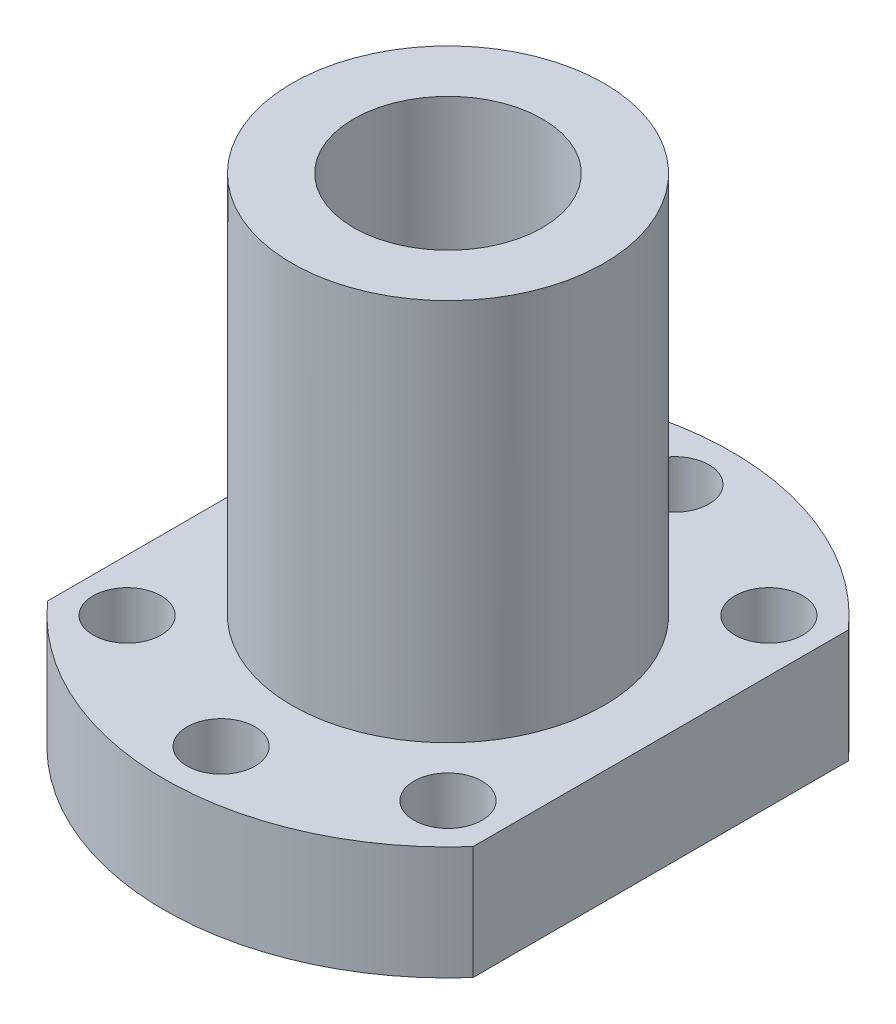
ISO-10303-21;
HEADER;
FILE_DESCRIPTION(('STEP AP214'),'2;1');
FILE_NAME('part.step','',(''),(''),'','','');
FILE_SCHEMA(('AUTOMOTIVE_DESIGN { 1 0 10303 214 1 1 1 1 }'));
ENDSEC;
DATA;
#1=APPLICATION_CONTEXT('core data for automotive mechanical design processes');
#2=APPLICATION_PROTOCOL_DEFINITION('international standard','automotive_design',2000,#1);
#3=PRODUCT_CONTEXT('',#1,'mechanical');
#4=PRODUCT('Part','Part','',(#3));
#5=PRODUCT_RELATED_PRODUCT_CATEGORY('part','',(#4));
#6=PRODUCT_DEFINITION_FORMATION('','',#4);
#7=PRODUCT_DEFINITION_CONTEXT('part definition',#1,'design');
#8=PRODUCT_DEFINITION('design','',#6,#7);
#9=PRODUCT_DEFINITION_SHAPE('','',#8);
#10=(LENGTH_UNIT() NAMED_UNIT(*) SI_UNIT(.MILLI.,.METRE.));
#11=(NAMED_UNIT(*) PLANE_ANGLE_UNIT() SI_UNIT($,.RADIAN.));
#12=(NAMED_UNIT(*) SI_UNIT($,.STERADIAN.) SOLID_ANGLE_UNIT());
#13=UNCERTAINTY_MEASURE_WITH_UNIT(LENGTH_MEASURE(1.E-05),#10,'distance_accuracy_value','');
#14=(GEOMETRIC_REPRESENTATION_CONTEXT(3) GLOBAL_UNCERTAINTY_ASSIGNED_CONTEXT((#13)) GLOBAL_UNIT_ASSIGNED_CONTEXT((#10,
#11,#12)) REPRESENTATION_CONTEXT('',''));
#15=CARTESIAN_POINT('',(0.,0.,0.));
#16=DIRECTION('',(0.,0.,1.));
#17=DIRECTION('',(1.,0.,0.));
#18=AXIS2_PLACEMENT_3D('',#15,#16,#17);
#19=CARTESIAN_POINT('',(0.,8.,0.));
#20=DIRECTION('',(0.,-1.,0.));
#21=DIRECTION('',(0.,0.,-1.));
#22=AXIS2_PLACEMENT_3D('',#19,#20,#21);
#23=CYLINDRICAL_SURFACE('',#22,20.);
#24=CARTESIAN_POINT('',(0.,8.,0.));
#25=DIRECTION('',(0.,1.,0.));
#26=DIRECTION('',(0.,0.,1.));
#27=AXIS2_PLACEMENT_3D('',#24,#25,#26);
#28=CIRCLE('',#27,20.);
#29=CARTESIAN_POINT('',(15.,8.,-13.2287565553229));
#30=VERTEX_POINT('',#29);
#31=CARTESIAN_POINT('',(-15.,8.,-13.228756555323));
#32=VERTEX_POINT('',#31);
#33=EDGE_CURVE('E52',#30,#32,#28,.T.);
#34=ORIENTED_EDGE('',*,*,#33,.F.);
#35=DIRECTION('',(0.,-1.,0.));
#36=VECTOR('',#35,1.);
#37=CARTESIAN_POINT('',(15.,35.,-13.2287565553229));
#38=LINE('',#37,#36);
#39=CARTESIAN_POINT('',(15.,0.,-13.2287565553229));
#40=VERTEX_POINT('',#39);
#41=EDGE_CURVE('E86',#30,#40,#38,.T.);
#42=ORIENTED_EDGE('',*,*,#41,.T.);
#43=CARTESIAN_POINT('',(0.,0.,0.));
#44=DIRECTION('',(0.,1.,0.));
#45=DIRECTION('',(0.,0.,1.));
#46=AXIS2_PLACEMENT_3D('',#43,#44,#45);
#47=CIRCLE('',#46,20.);
#48=CARTESIAN_POINT('',(-15.,0.,-13.228756555323));
#49=VERTEX_POINT('',#48);
#50=EDGE_CURVE('E98',#40,#49,#47,.T.);
#51=ORIENTED_EDGE('',*,*,#50,.T.);
#52=DIRECTION('',(0.,-1.,0.));
#53=VECTOR('',#52,1.);
#54=CARTESIAN_POINT('',(-15.,35.,-13.228756555323));
#55=LINE('',#54,#53);
#56=EDGE_CURVE('E60',#32,#49,#55,.T.);
#57=ORIENTED_EDGE('',*,*,#56,.F.);
#58=EDGE_LOOP('',(#34,#42,#51,#57));
#59=FACE_BOUND('',#58,.T.);
#60=ADVANCED_FACE('F42',(#59),#23,.T.);
#61=CARTESIAN_POINT('',(-15.,0.,13.2287565553229));
#62=VERTEX_POINT('',#61);
#63=CARTESIAN_POINT('',(15.,0.,13.2287565553229));
#64=VERTEX_POINT('',#63);
#65=EDGE_CURVE('E46',#62,#64,#47,.T.);
#66=ORIENTED_EDGE('',*,*,#65,.T.);
#67=DIRECTION('',(0.,-1.,0.));
#68=VECTOR('',#67,1.);
#69=CARTESIAN_POINT('',(15.,35.,13.2287565553229));
#70=LINE('',#69,#68);
#71=CARTESIAN_POINT('',(15.,8.,13.2287565553229));
#72=VERTEX_POINT('',#71);
#73=EDGE_CURVE('E68',#72,#64,#70,.T.);
#74=ORIENTED_EDGE('',*,*,#73,.F.);
#75=CARTESIAN_POINT('',(-15.,8.,13.2287565553229));
#76=VERTEX_POINT('',#75);
#77=EDGE_CURVE('E105',#76,#72,#28,.T.);
#78=ORIENTED_EDGE('',*,*,#77,.F.);
#79=DIRECTION('',(0.,-1.,0.));
#80=VECTOR('',#79,1.);
#81=CARTESIAN_POINT('',(-15.,35.,13.2287565553229));
#82=LINE('',#81,#80);
#83=EDGE_CURVE('E125',#76,#62,#82,.T.);
#84=ORIENTED_EDGE('',*,*,#83,.T.);
#85=EDGE_LOOP('',(#66,#74,#78,#84));
#86=FACE_BOUND('',#85,.T.);
#87=ADVANCED_FACE('F44',(#86),#23,.T.);
#88=CARTESIAN_POINT('',(0.,8.,0.));
#89=DIRECTION('',(0.,1.,0.));
#90=DIRECTION('',(0.,0.,1.));
#91=AXIS2_PLACEMENT_3D('',#88,#89,#90);
#92=PLANE('',#91);
#93=CARTESIAN_POINT('',(11.3137084989848,8.,11.3137084989847));
#94=DIRECTION('',(0.,1.,0.));
#95=DIRECTION('',(0.,0.,1.));
#96=AXIS2_PLACEMENT_3D('',#93,#94,#95);
#97=CIRCLE('',#96,2.4);
#98=CARTESIAN_POINT('',(11.3137084989848,8.,13.7137084989847));
#99=VERTEX_POINT('',#98);
#100=EDGE_CURVE('E128',#99,#99,#97,.T.);
#101=ORIENTED_EDGE('',*,*,#100,.F.);
#102=EDGE_LOOP('',(#101));
#103=FACE_BOUND('',#102,.T.);
#104=CARTESIAN_POINT('',(11.3137084989848,8.,-11.3137084989848));
#105=DIRECTION('',(0.,1.,0.));
#106=DIRECTION('',(0.,0.,1.));
#107=AXIS2_PLACEMENT_3D('',#104,#105,#106);
#108=CIRCLE('',#107,2.4);
#109=CARTESIAN_POINT('',(11.3137084989848,8.,-8.91370849898476));
#110=VERTEX_POINT('',#109);
#111=EDGE_CURVE('E136',#110,#110,#108,.T.);
#112=ORIENTED_EDGE('',*,*,#111,.F.);
#113=EDGE_LOOP('',(#112));
#114=FACE_BOUND('',#113,.T.);
#115=CARTESIAN_POINT('',(0.,8.,-16.));
#116=DIRECTION('',(0.,1.,0.));
#117=DIRECTION('',(0.,0.,1.));
#118=AXIS2_PLACEMENT_3D('',#115,#116,#117);
#119=CIRCLE('',#118,2.4);
#120=CARTESIAN_POINT('',(0.,8.,-13.6));
#121=VERTEX_POINT('',#120);
#122=EDGE_CURVE('E140',#121,#121,#119,.T.);
#123=ORIENTED_EDGE('',*,*,#122,.F.);
#124=EDGE_LOOP('',(#123));
#125=FACE_BOUND('',#124,.T.);
#126=CARTESIAN_POINT('',(-11.3137084989848,8.,-11.3137084989848));
#127=DIRECTION('',(0.,1.,0.));
#128=DIRECTION('',(0.,0.,1.));
#129=AXIS2_PLACEMENT_3D('',#126,#127,#128);
#130=CIRCLE('',#129,2.4);
#131=CARTESIAN_POINT('',(-11.3137084989848,8.,-8.91370849898476));
#132=VERTEX_POINT('',#131);
#133=EDGE_CURVE('E144',#132,#132,#130,.T.);
#134=ORIENTED_EDGE('',*,*,#133,.F.);
#135=EDGE_LOOP('',(#134));
#136=FACE_BOUND('',#135,.T.);
#137=CARTESIAN_POINT('',(-11.3137084989846,8.,11.3137084989844));
#138=DIRECTION('',(0.,1.,0.));
#139=DIRECTION('',(0.,0.,1.));
#140=AXIS2_PLACEMENT_3D('',#137,#138,#139);
#141=CIRCLE('',#140,2.4);
#142=CARTESIAN_POINT('',(-11.3137084989846,8.,13.7137084989844));
#143=VERTEX_POINT('',#142);
#144=EDGE_CURVE('E148',#143,#143,#141,.T.);
#145=ORIENTED_EDGE('',*,*,#144,.F.);
#146=EDGE_LOOP('',(#145));
#147=FACE_BOUND('',#146,.T.);
#148=CARTESIAN_POINT('',(0.,8.,16.));
#149=DIRECTION('',(0.,1.,0.));
#150=DIRECTION('',(0.,0.,1.));
#151=AXIS2_PLACEMENT_3D('',#148,#149,#150);
#152=CIRCLE('',#151,2.4);
#153=CARTESIAN_POINT('',(0.,8.,18.4));
#154=VERTEX_POINT('',#153);
#155=EDGE_CURVE('E152',#154,#154,#152,.T.);
#156=ORIENTED_EDGE('',*,*,#155,.F.);
#157=EDGE_LOOP('',(#156));
#158=FACE_BOUND('',#157,.T.);
#159=DIRECTION('',(0.,0.,1.));
#160=VECTOR('',#159,1.);
#161=CARTESIAN_POINT('',(15.,8.,0.));
#162=LINE('',#161,#160);
#163=EDGE_CURVE('E114',#30,#72,#162,.T.);
#164=ORIENTED_EDGE('',*,*,#163,.F.);
#165=ORIENTED_EDGE('',*,*,#33,.T.);
#166=DIRECTION('',(0.,0.,-1.));
#167=VECTOR('',#166,1.);
#168=CARTESIAN_POINT('',(-15.,8.,0.));
#169=LINE('',#168,#167);
#170=EDGE_CURVE('E101',#76,#32,#169,.T.);
#171=ORIENTED_EDGE('',*,*,#170,.F.);
#172=ORIENTED_EDGE('',*,*,#77,.T.);
#173=EDGE_LOOP('',(#164,#165,#171,#172));
#174=FACE_BOUND('',#173,.T.);
#175=CARTESIAN_POINT('',(0.,8.,0.));
#176=DIRECTION('',(0.,1.,0.));
#177=DIRECTION('',(0.,0.,1.));
#178=AXIS2_PLACEMENT_3D('',#175,#176,#177);
#179=CIRCLE('',#178,11.);
#180=CARTESIAN_POINT('',(0.,8.,11.));
#181=VERTEX_POINT('',#180);
#182=EDGE_CURVE('E11',#181,#181,#179,.T.);
#183=ORIENTED_EDGE('',*,*,#182,.F.);
#184=EDGE_LOOP('',(#183));
#185=FACE_BOUND('',#184,.T.);
#186=ADVANCED_FACE('F202',(#103,#114,#125,#136,#147,#158,#174,#185),#92,.T.);
#187=CARTESIAN_POINT('',(0.,0.,0.));
#188=DIRECTION('',(0.,1.,0.));
#189=DIRECTION('',(0.,0.,1.));
#190=AXIS2_PLACEMENT_3D('',#187,#188,#189);
#191=PLANE('',#190);
#192=CARTESIAN_POINT('',(0.,0.,0.));
#193=DIRECTION('',(0.,-1.,0.));
#194=DIRECTION('',(0.,0.,-1.));
#195=AXIS2_PLACEMENT_3D('',#192,#193,#194);
#196=CIRCLE('',#195,6.65);
#197=CARTESIAN_POINT('',(0.,0.,-6.65));
#198=VERTEX_POINT('',#197);
#199=EDGE_CURVE('E181',#198,#198,#196,.T.);
#200=ORIENTED_EDGE('',*,*,#199,.F.);
#201=EDGE_LOOP('',(#200));
#202=FACE_BOUND('',#201,.T.);
#203=CARTESIAN_POINT('',(11.3137084989848,0.,11.3137084989847));
#204=DIRECTION('',(0.,-1.,0.));
#205=DIRECTION('',(0.,0.,-1.));
#206=AXIS2_PLACEMENT_3D('',#203,#204,#205);
#207=CIRCLE('',#206,2.4);
#208=CARTESIAN_POINT('',(11.3137084989848,0.,8.91370849898474));
#209=VERTEX_POINT('',#208);
#210=EDGE_CURVE('E160',#209,#209,#207,.T.);
#211=ORIENTED_EDGE('',*,*,#210,.F.);
#212=EDGE_LOOP('',(#211));
#213=FACE_BOUND('',#212,.T.);
#214=CARTESIAN_POINT('',(11.3137084989848,0.,-11.3137084989848));
#215=DIRECTION('',(0.,-1.,0.));
#216=DIRECTION('',(0.,0.,-1.));
#217=AXIS2_PLACEMENT_3D('',#214,#215,#216);
#218=CIRCLE('',#217,2.4);
#219=CARTESIAN_POINT('',(11.3137084989848,0.,-13.7137084989848));
#220=VERTEX_POINT('',#219);
#221=EDGE_CURVE('E170',#220,#220,#218,.T.);
#222=ORIENTED_EDGE('',*,*,#221,.F.);
#223=EDGE_LOOP('',(#222));
#224=FACE_BOUND('',#223,.T.);
#225=CARTESIAN_POINT('',(0.,0.,-16.));
#226=DIRECTION('',(0.,-1.,0.));
#227=DIRECTION('',(0.,0.,-1.));
#228=AXIS2_PLACEMENT_3D('',#225,#226,#227);
#229=CIRCLE('',#228,2.4);
#230=CARTESIAN_POINT('',(0.,0.,-18.4));
#231=VERTEX_POINT('',#230);
#232=EDGE_CURVE('E165',#231,#231,#229,.T.);
#233=ORIENTED_EDGE('',*,*,#232,.F.);
#234=EDGE_LOOP('',(#233));
#235=FACE_BOUND('',#234,.T.);
#236=CARTESIAN_POINT('',(-11.3137084989848,0.,-11.3137084989848));
#237=DIRECTION('',(0.,-1.,0.));
#238=DIRECTION('',(0.,0.,-1.));
#239=AXIS2_PLACEMENT_3D('',#236,#237,#238);
#240=CIRCLE('',#239,2.4);
#241=CARTESIAN_POINT('',(-11.3137084989848,0.,-13.7137084989848));
#242=VERTEX_POINT('',#241);
#243=EDGE_CURVE('E161',#242,#242,#240,.T.);
#244=ORIENTED_EDGE('',*,*,#243,.F.);
#245=EDGE_LOOP('',(#244));
#246=FACE_BOUND('',#245,.T.);
#247=CARTESIAN_POINT('',(-11.3137084989846,0.,11.3137084989844));
#248=DIRECTION('',(0.,-1.,0.));
#249=DIRECTION('',(0.,0.,-1.));
#250=AXIS2_PLACEMENT_3D('',#247,#248,#249);
#251=CIRCLE('',#250,2.4);
#252=CARTESIAN_POINT('',(-11.3137084989846,0.,8.91370849898444));
#253=VERTEX_POINT('',#252);
#254=EDGE_CURVE('E166',#253,#253,#251,.T.);
#255=ORIENTED_EDGE('',*,*,#254,.F.);
#256=EDGE_LOOP('',(#255));
#257=FACE_BOUND('',#256,.T.);
#258=CARTESIAN_POINT('',(0.,0.,16.));
#259=DIRECTION('',(0.,-1.,0.));
#260=DIRECTION('',(0.,0.,-1.));
#261=AXIS2_PLACEMENT_3D('',#258,#259,#260);
#262=CIRCLE('',#261,2.4);
#263=CARTESIAN_POINT('',(0.,0.,13.6));
#264=VERTEX_POINT('',#263);
#265=EDGE_CURVE('E156',#264,#264,#262,.T.);
#266=ORIENTED_EDGE('',*,*,#265,.F.);
#267=EDGE_LOOP('',(#266));
#268=FACE_BOUND('',#267,.T.);
#269=ORIENTED_EDGE('',*,*,#50,.F.);
#270=DIRECTION('',(0.,0.,-1.));
#271=VECTOR('',#270,1.);
#272=CARTESIAN_POINT('',(15.,0.,13.2287565553229));
#273=LINE('',#272,#271);
#274=EDGE_CURVE('E83',#64,#40,#273,.T.);
#275=ORIENTED_EDGE('',*,*,#274,.F.);
#276=ORIENTED_EDGE('',*,*,#65,.F.);
#277=DIRECTION('',(0.,0.,1.));
#278=VECTOR('',#277,1.);
#279=CARTESIAN_POINT('',(-15.,0.,13.2287565553229));
#280=LINE('',#279,#278);
#281=EDGE_CURVE('E93',#49,#62,#280,.T.);
#282=ORIENTED_EDGE('',*,*,#281,.F.);
#283=EDGE_LOOP('',(#269,#275,#276,#282));
#284=FACE_BOUND('',#283,.T.);
#285=ADVANCED_FACE('F103',(#202,#213,#224,#235,#246,#257,#268,#284),#191,.F.);
#286=CARTESIAN_POINT('',(0.,35.,0.));
#287=DIRECTION('',(0.,-1.,0.));
#288=DIRECTION('',(0.,0.,-1.));
#289=AXIS2_PLACEMENT_3D('',#286,#287,#288);
#290=CYLINDRICAL_SURFACE('',#289,11.);
#291=ORIENTED_EDGE('',*,*,#182,.T.);
#292=EDGE_LOOP('',(#291));
#293=FACE_BOUND('',#292,.T.);
#294=CARTESIAN_POINT('',(0.,35.,0.));
#295=DIRECTION('',(0.,-1.,0.));
#296=DIRECTION('',(0.,0.,-1.));
#297=AXIS2_PLACEMENT_3D('',#294,#295,#296);
#298=CIRCLE('',#297,11.);
#299=CARTESIAN_POINT('',(0.,35.,-11.));
#300=VERTEX_POINT('',#299);
#301=EDGE_CURVE('E109',#300,#300,#298,.T.);
#302=ORIENTED_EDGE('',*,*,#301,.T.);
#303=EDGE_LOOP('',(#302));
#304=FACE_BOUND('',#303,.T.);
#305=ADVANCED_FACE('F201',(#293,#304),#290,.T.);
#306=CARTESIAN_POINT('',(0.,35.,0.));
#307=DIRECTION('',(0.,-1.,0.));
#308=DIRECTION('',(0.,0.,-1.));
#309=AXIS2_PLACEMENT_3D('',#306,#307,#308);
#310=PLANE('',#309);
#311=CARTESIAN_POINT('',(0.,35.,0.));
#312=DIRECTION('',(0.,-1.,0.));
#313=DIRECTION('',(0.,0.,-1.));
#314=AXIS2_PLACEMENT_3D('',#311,#312,#313);
#315=CIRCLE('',#314,6.65);
#316=CARTESIAN_POINT('',(0.,35.,-6.65));
#317=VERTEX_POINT('',#316);
#318=EDGE_CURVE('E180',#317,#317,#315,.T.);
#319=ORIENTED_EDGE('',*,*,#318,.T.);
#320=EDGE_LOOP('',(#319));
#321=FACE_BOUND('',#320,.T.);
#322=ORIENTED_EDGE('',*,*,#301,.F.);
#323=EDGE_LOOP('',(#322));
#324=FACE_BOUND('',#323,.T.);
#325=ADVANCED_FACE('F189',(#321,#324),#310,.F.);
#326=CARTESIAN_POINT('',(-15.,35.,13.2287565553229));
#327=DIRECTION('',(1.,0.,0.));
#328=DIRECTION('',(0.,0.,-1.));
#329=AXIS2_PLACEMENT_3D('',#326,#327,#328);
#330=PLANE('',#329);
#331=ORIENTED_EDGE('',*,*,#170,.T.);
#332=ORIENTED_EDGE('',*,*,#56,.T.);
#333=ORIENTED_EDGE('',*,*,#281,.T.);
#334=ORIENTED_EDGE('',*,*,#83,.F.);
#335=EDGE_LOOP('',(#331,#332,#333,#334));
#336=FACE_BOUND('',#335,.T.);
#337=ADVANCED_FACE('F227',(#336),#330,.F.);
#338=CARTESIAN_POINT('',(15.,35.,13.2287565553229));
#339=DIRECTION('',(-1.,0.,0.));
#340=DIRECTION('',(0.,0.,1.));
#341=AXIS2_PLACEMENT_3D('',#338,#339,#340);
#342=PLANE('',#341);
#343=ORIENTED_EDGE('',*,*,#163,.T.);
#344=ORIENTED_EDGE('',*,*,#73,.T.);
#345=ORIENTED_EDGE('',*,*,#274,.T.);
#346=ORIENTED_EDGE('',*,*,#41,.F.);
#347=EDGE_LOOP('',(#343,#344,#345,#346));
#348=FACE_BOUND('',#347,.T.);
#349=ADVANCED_FACE('F85',(#348),#342,.F.);
#350=CARTESIAN_POINT('',(0.,35.,16.));
#351=DIRECTION('',(0.,-1.,0.));
#352=DIRECTION('',(0.,0.,-1.));
#353=AXIS2_PLACEMENT_3D('',#350,#351,#352);
#354=CYLINDRICAL_SURFACE('',#353,2.4);
#355=ORIENTED_EDGE('',*,*,#155,.T.);
#356=EDGE_LOOP('',(#355));
#357=FACE_BOUND('',#356,.T.);
#358=ORIENTED_EDGE('',*,*,#265,.T.);
#359=EDGE_LOOP('',(#358));
#360=FACE_BOUND('',#359,.T.);
#361=ADVANCED_FACE('F215',(#357,#360),#354,.F.);
#362=CARTESIAN_POINT('',(-11.3137084989846,35.,11.3137084989844));
#363=DIRECTION('',(0.,-1.,0.));
#364=DIRECTION('',(0.,0.,-1.));
#365=AXIS2_PLACEMENT_3D('',#362,#363,#364);
#366=CYLINDRICAL_SURFACE('',#365,2.4);
#367=ORIENTED_EDGE('',*,*,#144,.T.);
#368=EDGE_LOOP('',(#367));
#369=FACE_BOUND('',#368,.T.);
#370=ORIENTED_EDGE('',*,*,#254,.T.);
#371=EDGE_LOOP('',(#370));
#372=FACE_BOUND('',#371,.T.);
#373=ADVANCED_FACE('F217',(#369,#372),#366,.F.);
#374=CARTESIAN_POINT('',(-11.3137084989848,35.,-11.3137084989848));
#375=DIRECTION('',(0.,-1.,0.));
#376=DIRECTION('',(0.,0.,-1.));
#377=AXIS2_PLACEMENT_3D('',#374,#375,#376);
#378=CYLINDRICAL_SURFACE('',#377,2.4);
#379=ORIENTED_EDGE('',*,*,#133,.T.);
#380=EDGE_LOOP('',(#379));
#381=FACE_BOUND('',#380,.T.);
#382=ORIENTED_EDGE('',*,*,#243,.T.);
#383=EDGE_LOOP('',(#382));
#384=FACE_BOUND('',#383,.T.);
#385=ADVANCED_FACE('F224',(#381,#384),#378,.F.);
#386=CARTESIAN_POINT('',(0.,35.,-16.));
#387=DIRECTION('',(0.,-1.,0.));
#388=DIRECTION('',(0.,0.,-1.));
#389=AXIS2_PLACEMENT_3D('',#386,#387,#388);
#390=CYLINDRICAL_SURFACE('',#389,2.4);
#391=ORIENTED_EDGE('',*,*,#122,.T.);
#392=EDGE_LOOP('',(#391));
#393=FACE_BOUND('',#392,.T.);
#394=ORIENTED_EDGE('',*,*,#232,.T.);
#395=EDGE_LOOP('',(#394));
#396=FACE_BOUND('',#395,.T.);
#397=ADVANCED_FACE('F293',(#393,#396),#390,.F.);
#398=CARTESIAN_POINT('',(11.3137084989848,35.,-11.3137084989848));
#399=DIRECTION('',(0.,-1.,0.));
#400=DIRECTION('',(0.,0.,-1.));
#401=AXIS2_PLACEMENT_3D('',#398,#399,#400);
#402=CYLINDRICAL_SURFACE('',#401,2.4);
#403=ORIENTED_EDGE('',*,*,#111,.T.);
#404=EDGE_LOOP('',(#403));
#405=FACE_BOUND('',#404,.T.);
#406=ORIENTED_EDGE('',*,*,#221,.T.);
#407=EDGE_LOOP('',(#406));
#408=FACE_BOUND('',#407,.T.);
#409=ADVANCED_FACE('F303',(#405,#408),#402,.F.);
#410=CARTESIAN_POINT('',(11.3137084989848,35.,11.3137084989847));
#411=DIRECTION('',(0.,-1.,0.));
#412=DIRECTION('',(0.,0.,-1.));
#413=AXIS2_PLACEMENT_3D('',#410,#411,#412);
#414=CYLINDRICAL_SURFACE('',#413,2.4);
#415=ORIENTED_EDGE('',*,*,#100,.T.);
#416=EDGE_LOOP('',(#415));
#417=FACE_BOUND('',#416,.T.);
#418=ORIENTED_EDGE('',*,*,#210,.T.);
#419=EDGE_LOOP('',(#418));
#420=FACE_BOUND('',#419,.T.);
#421=ADVANCED_FACE('F195',(#417,#420),#414,.F.);
#422=CARTESIAN_POINT('',(0.,35.,0.));
#423=DIRECTION('',(0.,-1.,0.));
#424=DIRECTION('',(0.,0.,-1.));
#425=AXIS2_PLACEMENT_3D('',#422,#423,#424);
#426=CYLINDRICAL_SURFACE('',#425,6.65);
#427=ORIENTED_EDGE('',*,*,#318,.F.);
#428=EDGE_LOOP('',(#427));
#429=FACE_BOUND('',#428,.T.);
#430=ORIENTED_EDGE('',*,*,#199,.T.);
#431=EDGE_LOOP('',(#430));
#432=FACE_BOUND('',#431,.T.);
#433=ADVANCED_FACE('F192',(#429,#432),#426,.F.);
#434=CLOSED_SHELL('',(#60,#87,#186,#285,#305,#325,#337,#349,#361,#373,#385,#397,#409,#421,#433));
#435=MANIFOLD_SOLID_BREP('B2',#434);
#436=ADVANCED_BREP_SHAPE_REPRESENTATION('',(#18,#435),#14);
#437=SHAPE_DEFINITION_REPRESENTATION(#9,#436);
ENDSEC;
END-ISO-10303-21;
